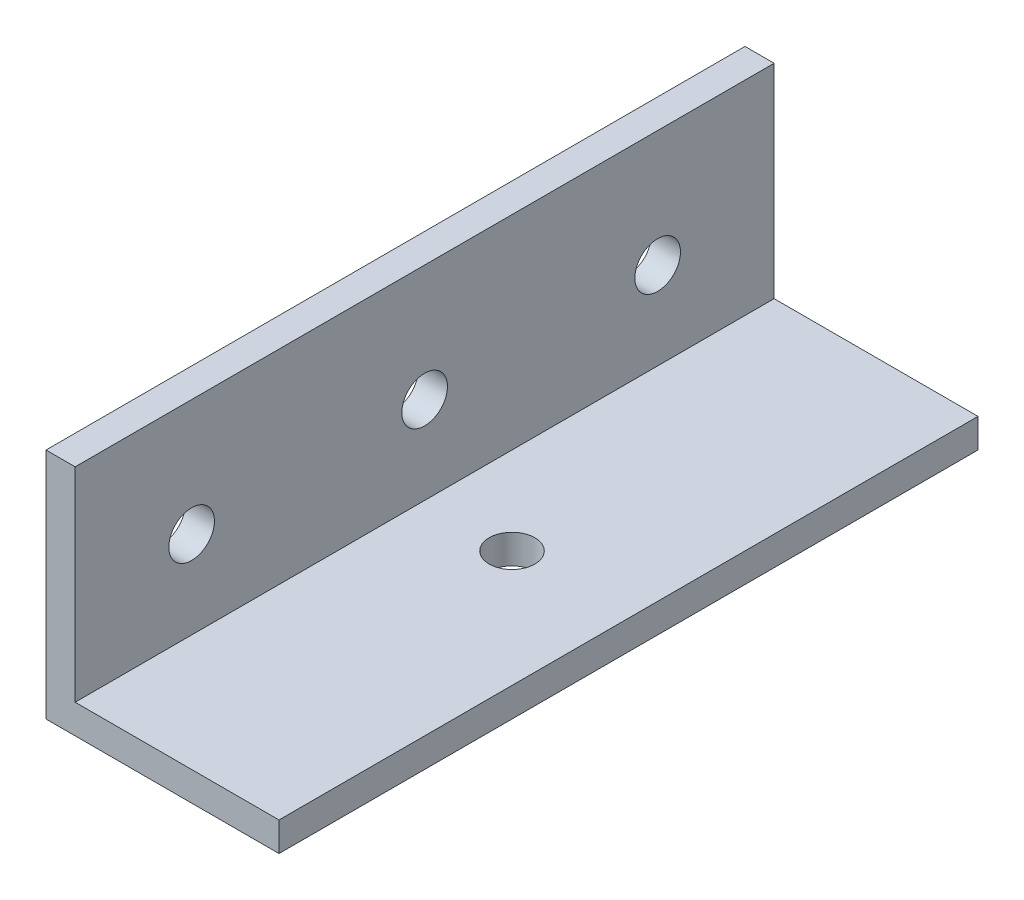
ISO-10303-21;
HEADER;
FILE_DESCRIPTION(('STEP AP214'),'2;1');
FILE_NAME('part.step','',(''),(''),'','','');
FILE_SCHEMA(('AUTOMOTIVE_DESIGN { 1 0 10303 214 1 1 1 1 }'));
ENDSEC;
DATA;
#1=APPLICATION_CONTEXT('core data for automotive mechanical design processes');
#2=APPLICATION_PROTOCOL_DEFINITION('international standard','automotive_design',2000,#1);
#3=PRODUCT_CONTEXT('',#1,'mechanical');
#4=PRODUCT('Part','Part','',(#3));
#5=PRODUCT_RELATED_PRODUCT_CATEGORY('part','',(#4));
#6=PRODUCT_DEFINITION_FORMATION('','',#4);
#7=PRODUCT_DEFINITION_CONTEXT('part definition',#1,'design');
#8=PRODUCT_DEFINITION('design','',#6,#7);
#9=PRODUCT_DEFINITION_SHAPE('','',#8);
#10=(LENGTH_UNIT() NAMED_UNIT(*) SI_UNIT(.MILLI.,.METRE.));
#11=(NAMED_UNIT(*) PLANE_ANGLE_UNIT() SI_UNIT($,.RADIAN.));
#12=(NAMED_UNIT(*) SI_UNIT($,.STERADIAN.) SOLID_ANGLE_UNIT());
#13=UNCERTAINTY_MEASURE_WITH_UNIT(LENGTH_MEASURE(1.E-05),#10,'distance_accuracy_value','');
#14=(GEOMETRIC_REPRESENTATION_CONTEXT(3) GLOBAL_UNCERTAINTY_ASSIGNED_CONTEXT((#13)) GLOBAL_UNIT_ASSIGNED_CONTEXT((#10,
#11,#12)) REPRESENTATION_CONTEXT('',''));
#15=CARTESIAN_POINT('',(0.,0.,0.));
#16=DIRECTION('',(0.,0.,1.));
#17=DIRECTION('',(1.,0.,0.));
#18=AXIS2_PLACEMENT_3D('',#15,#16,#17);
#19=CARTESIAN_POINT('',(0.,0.,76.2));
#20=DIRECTION('',(1.,0.,0.));
#21=DIRECTION('',(0.,0.,-1.));
#22=AXIS2_PLACEMENT_3D('',#19,#20,#21);
#23=PLANE('',#22);
#24=CARTESIAN_POINT('',(0.,12.7,63.5));
#25=DIRECTION('',(1.,0.,0.));
#26=DIRECTION('',(0.,1.,0.));
#27=AXIS2_PLACEMENT_3D('',#24,#25,#26);
#28=CIRCLE('',#27,2.4892);
#29=CARTESIAN_POINT('',(0.,15.1892,63.5));
#30=VERTEX_POINT('',#29);
#31=EDGE_CURVE('E138',#30,#30,#28,.T.);
#32=ORIENTED_EDGE('',*,*,#31,.T.);
#33=EDGE_LOOP('',(#32));
#34=FACE_BOUND('',#33,.T.);
#35=CARTESIAN_POINT('',(0.,12.7,38.1));
#36=DIRECTION('',(1.,0.,0.));
#37=DIRECTION('',(0.,1.,0.));
#38=AXIS2_PLACEMENT_3D('',#35,#36,#37);
#39=CIRCLE('',#38,2.4892);
#40=CARTESIAN_POINT('',(0.,15.1892,38.1));
#41=VERTEX_POINT('',#40);
#42=EDGE_CURVE('E193',#41,#41,#39,.T.);
#43=ORIENTED_EDGE('',*,*,#42,.T.);
#44=EDGE_LOOP('',(#43));
#45=FACE_BOUND('',#44,.T.);
#46=CARTESIAN_POINT('',(0.,12.7,12.7));
#47=DIRECTION('',(1.,0.,0.));
#48=DIRECTION('',(0.,1.,0.));
#49=AXIS2_PLACEMENT_3D('',#46,#47,#48);
#50=CIRCLE('',#49,2.4892);
#51=CARTESIAN_POINT('',(0.,15.1892,12.7));
#52=VERTEX_POINT('',#51);
#53=EDGE_CURVE('E196',#52,#52,#50,.T.);
#54=ORIENTED_EDGE('',*,*,#53,.T.);
#55=EDGE_LOOP('',(#54));
#56=FACE_BOUND('',#55,.T.);
#57=DIRECTION('',(0.,-1.,0.));
#58=VECTOR('',#57,1.);
#59=CARTESIAN_POINT('',(0.,0.,0.));
#60=LINE('',#59,#58);
#61=CARTESIAN_POINT('',(0.,25.4,0.));
#62=VERTEX_POINT('',#61);
#63=CARTESIAN_POINT('',(0.,0.,0.));
#64=VERTEX_POINT('',#63);
#65=EDGE_CURVE('E133',#62,#64,#60,.T.);
#66=ORIENTED_EDGE('',*,*,#65,.T.);
#67=DIRECTION('',(0.,0.,-1.));
#68=VECTOR('',#67,1.);
#69=CARTESIAN_POINT('',(0.,0.,76.2));
#70=LINE('',#69,#68);
#71=CARTESIAN_POINT('',(0.,0.,76.2));
#72=VERTEX_POINT('',#71);
#73=EDGE_CURVE('E11',#72,#64,#70,.T.);
#74=ORIENTED_EDGE('',*,*,#73,.F.);
#75=DIRECTION('',(0.,-1.,0.));
#76=VECTOR('',#75,1.);
#77=CARTESIAN_POINT('',(0.,0.,76.2));
#78=LINE('',#77,#76);
#79=CARTESIAN_POINT('',(0.,25.4,76.2));
#80=VERTEX_POINT('',#79);
#81=EDGE_CURVE('E150',#80,#72,#78,.T.);
#82=ORIENTED_EDGE('',*,*,#81,.F.);
#83=DIRECTION('',(0.,0.,-1.));
#84=VECTOR('',#83,1.);
#85=CARTESIAN_POINT('',(0.,25.4,76.2));
#86=LINE('',#85,#84);
#87=EDGE_CURVE('E129',#80,#62,#86,.T.);
#88=ORIENTED_EDGE('',*,*,#87,.T.);
#89=EDGE_LOOP('',(#66,#74,#82,#88));
#90=FACE_BOUND('',#89,.T.);
#91=ADVANCED_FACE('F44',(#34,#45,#56,#90),#23,.F.);
#92=CARTESIAN_POINT('',(0.,0.,76.2));
#93=DIRECTION('',(0.,1.,0.));
#94=DIRECTION('',(0.,0.,1.));
#95=AXIS2_PLACEMENT_3D('',#92,#93,#94);
#96=PLANE('',#95);
#97=CARTESIAN_POINT('',(12.7,0.,38.1));
#98=DIRECTION('',(0.,1.,0.));
#99=DIRECTION('',(0.,0.,1.));
#100=AXIS2_PLACEMENT_3D('',#97,#98,#99);
#101=CIRCLE('',#100,2.4892);
#102=CARTESIAN_POINT('',(12.7,0.,40.5892));
#103=VERTEX_POINT('',#102);
#104=EDGE_CURVE('E200',#103,#103,#101,.T.);
#105=ORIENTED_EDGE('',*,*,#104,.T.);
#106=EDGE_LOOP('',(#105));
#107=FACE_BOUND('',#106,.T.);
#108=DIRECTION('',(1.,0.,0.));
#109=VECTOR('',#108,1.);
#110=CARTESIAN_POINT('',(0.,0.,0.));
#111=LINE('',#110,#109);
#112=CARTESIAN_POINT('',(25.4,0.,0.));
#113=VERTEX_POINT('',#112);
#114=EDGE_CURVE('E137',#64,#113,#111,.T.);
#115=ORIENTED_EDGE('',*,*,#114,.T.);
#116=DIRECTION('',(0.,0.,-1.));
#117=VECTOR('',#116,1.);
#118=CARTESIAN_POINT('',(25.4,0.,76.2));
#119=LINE('',#118,#117);
#120=CARTESIAN_POINT('',(25.4,0.,76.2));
#121=VERTEX_POINT('',#120);
#122=EDGE_CURVE('E53',#121,#113,#119,.T.);
#123=ORIENTED_EDGE('',*,*,#122,.F.);
#124=DIRECTION('',(1.,0.,0.));
#125=VECTOR('',#124,1.);
#126=CARTESIAN_POINT('',(0.,0.,76.2));
#127=LINE('',#126,#125);
#128=EDGE_CURVE('E98',#72,#121,#127,.T.);
#129=ORIENTED_EDGE('',*,*,#128,.F.);
#130=ORIENTED_EDGE('',*,*,#73,.T.);
#131=EDGE_LOOP('',(#115,#123,#129,#130));
#132=FACE_BOUND('',#131,.T.);
#133=ADVANCED_FACE('F180',(#107,#132),#96,.F.);
#134=CARTESIAN_POINT('',(25.4,0.,76.2));
#135=DIRECTION('',(-1.,0.,0.));
#136=DIRECTION('',(0.,0.,1.));
#137=AXIS2_PLACEMENT_3D('',#134,#135,#136);
#138=PLANE('',#137);
#139=DIRECTION('',(0.,1.,0.));
#140=VECTOR('',#139,1.);
#141=CARTESIAN_POINT('',(25.4,0.,0.));
#142=LINE('',#141,#140);
#143=CARTESIAN_POINT('',(25.4,3.175,0.));
#144=VERTEX_POINT('',#143);
#145=EDGE_CURVE('E141',#113,#144,#142,.T.);
#146=ORIENTED_EDGE('',*,*,#145,.T.);
#147=DIRECTION('',(0.,0.,-1.));
#148=VECTOR('',#147,1.);
#149=CARTESIAN_POINT('',(25.4,3.175,76.2));
#150=LINE('',#149,#148);
#151=CARTESIAN_POINT('',(25.4,3.175,76.2));
#152=VERTEX_POINT('',#151);
#153=EDGE_CURVE('E122',#152,#144,#150,.T.);
#154=ORIENTED_EDGE('',*,*,#153,.F.);
#155=DIRECTION('',(0.,1.,0.));
#156=VECTOR('',#155,1.);
#157=CARTESIAN_POINT('',(25.4,0.,76.2));
#158=LINE('',#157,#156);
#159=EDGE_CURVE('E111',#121,#152,#158,.T.);
#160=ORIENTED_EDGE('',*,*,#159,.F.);
#161=ORIENTED_EDGE('',*,*,#122,.T.);
#162=EDGE_LOOP('',(#146,#154,#160,#161));
#163=FACE_BOUND('',#162,.T.);
#164=ADVANCED_FACE('F160',(#163),#138,.F.);
#165=CARTESIAN_POINT('',(3.175,3.175,76.2));
#166=DIRECTION('',(0.,-1.,0.));
#167=DIRECTION('',(0.,0.,-1.));
#168=AXIS2_PLACEMENT_3D('',#165,#166,#167);
#169=PLANE('',#168);
#170=CARTESIAN_POINT('',(12.7,3.175,38.1));
#171=DIRECTION('',(0.,1.,0.));
#172=DIRECTION('',(0.,0.,1.));
#173=AXIS2_PLACEMENT_3D('',#170,#171,#172);
#174=CIRCLE('',#173,2.4892);
#175=CARTESIAN_POINT('',(12.7,3.175,40.5892));
#176=VERTEX_POINT('',#175);
#177=EDGE_CURVE('E207',#176,#176,#174,.T.);
#178=ORIENTED_EDGE('',*,*,#177,.F.);
#179=EDGE_LOOP('',(#178));
#180=FACE_BOUND('',#179,.T.);
#181=DIRECTION('',(-1.,0.,0.));
#182=VECTOR('',#181,1.);
#183=CARTESIAN_POINT('',(3.175,3.175,0.));
#184=LINE('',#183,#182);
#185=CARTESIAN_POINT('',(3.175,3.175,0.));
#186=VERTEX_POINT('',#185);
#187=EDGE_CURVE('E120',#144,#186,#184,.T.);
#188=ORIENTED_EDGE('',*,*,#187,.T.);
#189=DIRECTION('',(0.,0.,-1.));
#190=VECTOR('',#189,1.);
#191=CARTESIAN_POINT('',(3.175,3.175,76.2));
#192=LINE('',#191,#190);
#193=CARTESIAN_POINT('',(3.175,3.175,76.2));
#194=VERTEX_POINT('',#193);
#195=EDGE_CURVE('E117',#194,#186,#192,.T.);
#196=ORIENTED_EDGE('',*,*,#195,.F.);
#197=DIRECTION('',(-1.,0.,0.));
#198=VECTOR('',#197,1.);
#199=CARTESIAN_POINT('',(3.175,3.175,76.2));
#200=LINE('',#199,#198);
#201=EDGE_CURVE('E105',#152,#194,#200,.T.);
#202=ORIENTED_EDGE('',*,*,#201,.F.);
#203=ORIENTED_EDGE('',*,*,#153,.T.);
#204=EDGE_LOOP('',(#188,#196,#202,#203));
#205=FACE_BOUND('',#204,.T.);
#206=ADVANCED_FACE('F118',(#180,#205),#169,.F.);
#207=CARTESIAN_POINT('',(3.175,25.4,76.2));
#208=DIRECTION('',(-1.,0.,0.));
#209=DIRECTION('',(0.,-1.,0.));
#210=AXIS2_PLACEMENT_3D('',#207,#208,#209);
#211=PLANE('',#210);
#212=CARTESIAN_POINT('',(3.175,12.7,63.5));
#213=DIRECTION('',(1.,0.,0.));
#214=DIRECTION('',(0.,1.,0.));
#215=AXIS2_PLACEMENT_3D('',#212,#213,#214);
#216=CIRCLE('',#215,2.4892);
#217=CARTESIAN_POINT('',(3.175,15.1892,63.5));
#218=VERTEX_POINT('',#217);
#219=EDGE_CURVE('E217',#218,#218,#216,.T.);
#220=ORIENTED_EDGE('',*,*,#219,.F.);
#221=EDGE_LOOP('',(#220));
#222=FACE_BOUND('',#221,.T.);
#223=CARTESIAN_POINT('',(3.175,12.7,38.1));
#224=DIRECTION('',(1.,0.,0.));
#225=DIRECTION('',(0.,1.,0.));
#226=AXIS2_PLACEMENT_3D('',#223,#224,#225);
#227=CIRCLE('',#226,2.4892);
#228=CARTESIAN_POINT('',(3.175,15.1892,38.1));
#229=VERTEX_POINT('',#228);
#230=EDGE_CURVE('E221',#229,#229,#227,.T.);
#231=ORIENTED_EDGE('',*,*,#230,.F.);
#232=EDGE_LOOP('',(#231));
#233=FACE_BOUND('',#232,.T.);
#234=CARTESIAN_POINT('',(3.175,12.7,12.7));
#235=DIRECTION('',(1.,0.,0.));
#236=DIRECTION('',(0.,1.,0.));
#237=AXIS2_PLACEMENT_3D('',#234,#235,#236);
#238=CIRCLE('',#237,2.4892);
#239=CARTESIAN_POINT('',(3.175,15.1892,12.7));
#240=VERTEX_POINT('',#239);
#241=EDGE_CURVE('E199',#240,#240,#238,.T.);
#242=ORIENTED_EDGE('',*,*,#241,.F.);
#243=EDGE_LOOP('',(#242));
#244=FACE_BOUND('',#243,.T.);
#245=DIRECTION('',(0.,1.,0.));
#246=VECTOR('',#245,1.);
#247=CARTESIAN_POINT('',(3.175,25.4,0.));
#248=LINE('',#247,#246);
#249=CARTESIAN_POINT('',(3.175,25.4,0.));
#250=VERTEX_POINT('',#249);
#251=EDGE_CURVE('E84',#186,#250,#248,.T.);
#252=ORIENTED_EDGE('',*,*,#251,.T.);
#253=DIRECTION('',(0.,0.,-1.));
#254=VECTOR('',#253,1.);
#255=CARTESIAN_POINT('',(3.175,25.4,76.2));
#256=LINE('',#255,#254);
#257=CARTESIAN_POINT('',(3.175,25.4,76.2));
#258=VERTEX_POINT('',#257);
#259=EDGE_CURVE('E123',#258,#250,#256,.T.);
#260=ORIENTED_EDGE('',*,*,#259,.F.);
#261=DIRECTION('',(0.,1.,0.));
#262=VECTOR('',#261,1.);
#263=CARTESIAN_POINT('',(3.175,25.4,76.2));
#264=LINE('',#263,#262);
#265=EDGE_CURVE('E109',#194,#258,#264,.T.);
#266=ORIENTED_EDGE('',*,*,#265,.F.);
#267=ORIENTED_EDGE('',*,*,#195,.T.);
#268=EDGE_LOOP('',(#252,#260,#266,#267));
#269=FACE_BOUND('',#268,.T.);
#270=ADVANCED_FACE('F125',(#222,#233,#244,#269),#211,.F.);
#271=CARTESIAN_POINT('',(0.,25.4,76.2));
#272=DIRECTION('',(0.,-1.,0.));
#273=DIRECTION('',(0.,0.,-1.));
#274=AXIS2_PLACEMENT_3D('',#271,#272,#273);
#275=PLANE('',#274);
#276=DIRECTION('',(-1.,0.,0.));
#277=VECTOR('',#276,1.);
#278=CARTESIAN_POINT('',(0.,25.4,0.));
#279=LINE('',#278,#277);
#280=EDGE_CURVE('E90',#250,#62,#279,.T.);
#281=ORIENTED_EDGE('',*,*,#280,.T.);
#282=ORIENTED_EDGE('',*,*,#87,.F.);
#283=DIRECTION('',(-1.,0.,0.));
#284=VECTOR('',#283,1.);
#285=CARTESIAN_POINT('',(0.,25.4,76.2));
#286=LINE('',#285,#284);
#287=EDGE_CURVE('E61',#258,#80,#286,.T.);
#288=ORIENTED_EDGE('',*,*,#287,.F.);
#289=ORIENTED_EDGE('',*,*,#259,.T.);
#290=EDGE_LOOP('',(#281,#282,#288,#289));
#291=FACE_BOUND('',#290,.T.);
#292=ADVANCED_FACE('F167',(#291),#275,.F.);
#293=CARTESIAN_POINT('',(0.,0.,76.2));
#294=DIRECTION('',(0.,0.,-1.));
#295=DIRECTION('',(-1.,0.,0.));
#296=AXIS2_PLACEMENT_3D('',#293,#294,#295);
#297=PLANE('',#296);
#298=ORIENTED_EDGE('',*,*,#81,.T.);
#299=ORIENTED_EDGE('',*,*,#128,.T.);
#300=ORIENTED_EDGE('',*,*,#159,.T.);
#301=ORIENTED_EDGE('',*,*,#201,.T.);
#302=ORIENTED_EDGE('',*,*,#265,.T.);
#303=ORIENTED_EDGE('',*,*,#287,.T.);
#304=EDGE_LOOP('',(#298,#299,#300,#301,#302,#303));
#305=FACE_BOUND('',#304,.T.);
#306=ADVANCED_FACE('F107',(#305),#297,.F.);
#307=CARTESIAN_POINT('',(0.,0.,0.));
#308=DIRECTION('',(0.,0.,-1.));
#309=DIRECTION('',(-1.,0.,0.));
#310=AXIS2_PLACEMENT_3D('',#307,#308,#309);
#311=PLANE('',#310);
#312=ORIENTED_EDGE('',*,*,#65,.F.);
#313=ORIENTED_EDGE('',*,*,#280,.F.);
#314=ORIENTED_EDGE('',*,*,#251,.F.);
#315=ORIENTED_EDGE('',*,*,#187,.F.);
#316=ORIENTED_EDGE('',*,*,#145,.F.);
#317=ORIENTED_EDGE('',*,*,#114,.F.);
#318=EDGE_LOOP('',(#312,#313,#314,#315,#316,#317));
#319=FACE_BOUND('',#318,.T.);
#320=ADVANCED_FACE('F163',(#319),#311,.T.);
#321=CARTESIAN_POINT('',(0.,12.7,12.7));
#322=DIRECTION('',(1.,0.,0.));
#323=DIRECTION('',(0.,1.,0.));
#324=AXIS2_PLACEMENT_3D('',#321,#322,#323);
#325=CYLINDRICAL_SURFACE('',#324,2.4892);
#326=ORIENTED_EDGE('',*,*,#53,.F.);
#327=EDGE_LOOP('',(#326));
#328=FACE_BOUND('',#327,.T.);
#329=ORIENTED_EDGE('',*,*,#241,.T.);
#330=EDGE_LOOP('',(#329));
#331=FACE_BOUND('',#330,.T.);
#332=ADVANCED_FACE('F275',(#328,#331),#325,.F.);
#333=CARTESIAN_POINT('',(0.,12.7,38.1));
#334=DIRECTION('',(1.,0.,0.));
#335=DIRECTION('',(0.,1.,0.));
#336=AXIS2_PLACEMENT_3D('',#333,#334,#335);
#337=CYLINDRICAL_SURFACE('',#336,2.4892);
#338=ORIENTED_EDGE('',*,*,#42,.F.);
#339=EDGE_LOOP('',(#338));
#340=FACE_BOUND('',#339,.T.);
#341=ORIENTED_EDGE('',*,*,#230,.T.);
#342=EDGE_LOOP('',(#341));
#343=FACE_BOUND('',#342,.T.);
#344=ADVANCED_FACE('F282',(#340,#343),#337,.F.);
#345=CARTESIAN_POINT('',(0.,12.7,63.5));
#346=DIRECTION('',(1.,0.,0.));
#347=DIRECTION('',(0.,1.,0.));
#348=AXIS2_PLACEMENT_3D('',#345,#346,#347);
#349=CYLINDRICAL_SURFACE('',#348,2.4892);
#350=ORIENTED_EDGE('',*,*,#31,.F.);
#351=EDGE_LOOP('',(#350));
#352=FACE_BOUND('',#351,.T.);
#353=ORIENTED_EDGE('',*,*,#219,.T.);
#354=EDGE_LOOP('',(#353));
#355=FACE_BOUND('',#354,.T.);
#356=ADVANCED_FACE('F291',(#352,#355),#349,.F.);
#357=CARTESIAN_POINT('',(12.7,0.,38.1));
#358=DIRECTION('',(0.,1.,0.));
#359=DIRECTION('',(0.,0.,1.));
#360=AXIS2_PLACEMENT_3D('',#357,#358,#359);
#361=CYLINDRICAL_SURFACE('',#360,2.4892);
#362=ORIENTED_EDGE('',*,*,#104,.F.);
#363=EDGE_LOOP('',(#362));
#364=FACE_BOUND('',#363,.T.);
#365=ORIENTED_EDGE('',*,*,#177,.T.);
#366=EDGE_LOOP('',(#365));
#367=FACE_BOUND('',#366,.T.);
#368=ADVANCED_FACE('F231',(#364,#367),#361,.F.);
#369=CLOSED_SHELL('',(#91,#133,#164,#206,#270,#292,#306,#320,#332,#344,#356,#368));
#370=MANIFOLD_SOLID_BREP('B2',#369);
#371=ADVANCED_BREP_SHAPE_REPRESENTATION('',(#18,#370),#14);
#372=SHAPE_DEFINITION_REPRESENTATION(#9,#371);
ENDSEC;
END-ISO-10303-21;
